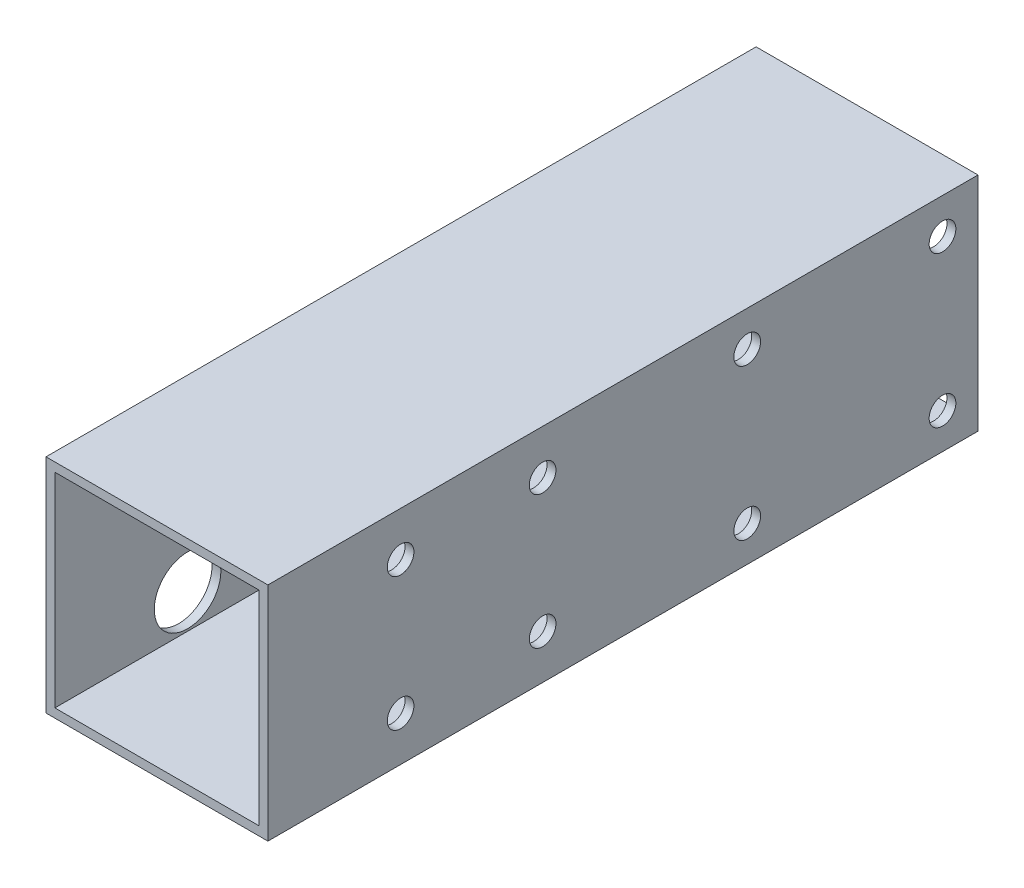
ISO-10303-21;
HEADER;
FILE_DESCRIPTION(('STEP AP214'),'2;1');
FILE_NAME('part.step','',(''),(''),'','','');
FILE_SCHEMA(('AUTOMOTIVE_DESIGN { 1 0 10303 214 1 1 1 1 }'));
ENDSEC;
DATA;
#1=APPLICATION_CONTEXT('core data for automotive mechanical design processes');
#2=APPLICATION_PROTOCOL_DEFINITION('international standard','automotive_design',2000,#1);
#3=PRODUCT_CONTEXT('',#1,'mechanical');
#4=PRODUCT('Part','Part','',(#3));
#5=PRODUCT_RELATED_PRODUCT_CATEGORY('part','',(#4));
#6=PRODUCT_DEFINITION_FORMATION('','',#4);
#7=PRODUCT_DEFINITION_CONTEXT('part definition',#1,'design');
#8=PRODUCT_DEFINITION('design','',#6,#7);
#9=PRODUCT_DEFINITION_SHAPE('','',#8);
#10=(LENGTH_UNIT() NAMED_UNIT(*) SI_UNIT(.MILLI.,.METRE.));
#11=(NAMED_UNIT(*) PLANE_ANGLE_UNIT() SI_UNIT($,.RADIAN.));
#12=(NAMED_UNIT(*) SI_UNIT($,.STERADIAN.) SOLID_ANGLE_UNIT());
#13=UNCERTAINTY_MEASURE_WITH_UNIT(LENGTH_MEASURE(1.E-05),#10,'distance_accuracy_value','');
#14=(GEOMETRIC_REPRESENTATION_CONTEXT(3) GLOBAL_UNCERTAINTY_ASSIGNED_CONTEXT((#13)) GLOBAL_UNIT_ASSIGNED_CONTEXT((#10,
#11,#12)) REPRESENTATION_CONTEXT('',''));
#15=CARTESIAN_POINT('',(0.,0.,0.));
#16=DIRECTION('',(0.,0.,1.));
#17=DIRECTION('',(1.,0.,0.));
#18=AXIS2_PLACEMENT_3D('',#15,#16,#17);
#19=CARTESIAN_POINT('',(0.,0.,40.));
#20=DIRECTION('',(0.,0.,-1.));
#21=DIRECTION('',(-1.,0.,0.));
#22=AXIS2_PLACEMENT_3D('',#19,#20,#21);
#23=PLANE('',#22);
#24=DIRECTION('',(0.,1.,0.));
#25=VECTOR('',#24,1.);
#26=CARTESIAN_POINT('',(12.5,-12.5,40.));
#27=LINE('',#26,#25);
#28=CARTESIAN_POINT('',(12.5,-12.5,40.));
#29=VERTEX_POINT('',#28);
#30=CARTESIAN_POINT('',(12.5,12.5,40.));
#31=VERTEX_POINT('',#30);
#32=EDGE_CURVE('E139',#29,#31,#27,.T.);
#33=ORIENTED_EDGE('',*,*,#32,.T.);
#34=DIRECTION('',(-1.,0.,0.));
#35=VECTOR('',#34,1.);
#36=CARTESIAN_POINT('',(-12.5,12.5,40.));
#37=LINE('',#36,#35);
#38=CARTESIAN_POINT('',(-12.5,12.5,40.));
#39=VERTEX_POINT('',#38);
#40=EDGE_CURVE('E142',#31,#39,#37,.T.);
#41=ORIENTED_EDGE('',*,*,#40,.T.);
#42=DIRECTION('',(0.,-1.,0.));
#43=VECTOR('',#42,1.);
#44=CARTESIAN_POINT('',(-12.5,-12.5,40.));
#45=LINE('',#44,#43);
#46=CARTESIAN_POINT('',(-12.5,-12.5,40.));
#47=VERTEX_POINT('',#46);
#48=EDGE_CURVE('E145',#39,#47,#45,.T.);
#49=ORIENTED_EDGE('',*,*,#48,.T.);
#50=DIRECTION('',(1.,0.,0.));
#51=VECTOR('',#50,1.);
#52=CARTESIAN_POINT('',(-12.5,-12.5,40.));
#53=LINE('',#52,#51);
#54=EDGE_CURVE('E147',#47,#29,#53,.T.);
#55=ORIENTED_EDGE('',*,*,#54,.T.);
#56=EDGE_LOOP('',(#33,#41,#49,#55));
#57=FACE_BOUND('',#56,.T.);
#58=DIRECTION('',(1.,0.,0.));
#59=VECTOR('',#58,1.);
#60=CARTESIAN_POINT('',(-11.5,-11.5,40.));
#61=LINE('',#60,#59);
#62=CARTESIAN_POINT('',(-11.5,-11.5,40.));
#63=VERTEX_POINT('',#62);
#64=CARTESIAN_POINT('',(11.5,-11.5,40.));
#65=VERTEX_POINT('',#64);
#66=EDGE_CURVE('E101',#63,#65,#61,.T.);
#67=ORIENTED_EDGE('',*,*,#66,.F.);
#68=DIRECTION('',(0.,-1.,0.));
#69=VECTOR('',#68,1.);
#70=CARTESIAN_POINT('',(-11.5,-11.5,40.));
#71=LINE('',#70,#69);
#72=CARTESIAN_POINT('',(-11.5,11.5,40.));
#73=VERTEX_POINT('',#72);
#74=EDGE_CURVE('E123',#73,#63,#71,.T.);
#75=ORIENTED_EDGE('',*,*,#74,.F.);
#76=DIRECTION('',(-1.,0.,0.));
#77=VECTOR('',#76,1.);
#78=CARTESIAN_POINT('',(-11.5,11.5,40.));
#79=LINE('',#78,#77);
#80=CARTESIAN_POINT('',(11.5,11.5,40.));
#81=VERTEX_POINT('',#80);
#82=EDGE_CURVE('E121',#81,#73,#79,.T.);
#83=ORIENTED_EDGE('',*,*,#82,.F.);
#84=DIRECTION('',(0.,1.,0.));
#85=VECTOR('',#84,1.);
#86=CARTESIAN_POINT('',(11.5,-11.5,40.));
#87=LINE('',#86,#85);
#88=EDGE_CURVE('E109',#65,#81,#87,.T.);
#89=ORIENTED_EDGE('',*,*,#88,.F.);
#90=EDGE_LOOP('',(#67,#75,#83,#89));
#91=FACE_BOUND('',#90,.T.);
#92=ADVANCED_FACE('F34',(#57,#91),#23,.F.);
#93=CARTESIAN_POINT('',(0.,0.,-40.));
#94=DIRECTION('',(0.,0.,-1.));
#95=DIRECTION('',(-1.,0.,0.));
#96=AXIS2_PLACEMENT_3D('',#93,#94,#95);
#97=PLANE('',#96);
#98=DIRECTION('',(0.,1.,0.));
#99=VECTOR('',#98,1.);
#100=CARTESIAN_POINT('',(12.5,-12.5,-40.));
#101=LINE('',#100,#99);
#102=CARTESIAN_POINT('',(12.5,-12.5,-40.));
#103=VERTEX_POINT('',#102);
#104=CARTESIAN_POINT('',(12.5,12.5,-40.));
#105=VERTEX_POINT('',#104);
#106=EDGE_CURVE('E117',#103,#105,#101,.T.);
#107=ORIENTED_EDGE('',*,*,#106,.F.);
#108=DIRECTION('',(1.,0.,0.));
#109=VECTOR('',#108,1.);
#110=CARTESIAN_POINT('',(-12.5,-12.5,-40.));
#111=LINE('',#110,#109);
#112=CARTESIAN_POINT('',(-12.5,-12.5,-40.));
#113=VERTEX_POINT('',#112);
#114=EDGE_CURVE('E143',#113,#103,#111,.T.);
#115=ORIENTED_EDGE('',*,*,#114,.F.);
#116=DIRECTION('',(0.,-1.,0.));
#117=VECTOR('',#116,1.);
#118=CARTESIAN_POINT('',(-12.5,-12.5,-40.));
#119=LINE('',#118,#117);
#120=CARTESIAN_POINT('',(-12.5,12.5,-40.));
#121=VERTEX_POINT('',#120);
#122=EDGE_CURVE('E154',#121,#113,#119,.T.);
#123=ORIENTED_EDGE('',*,*,#122,.F.);
#124=DIRECTION('',(-1.,0.,0.));
#125=VECTOR('',#124,1.);
#126=CARTESIAN_POINT('',(-12.5,12.5,-40.));
#127=LINE('',#126,#125);
#128=EDGE_CURVE('E152',#105,#121,#127,.T.);
#129=ORIENTED_EDGE('',*,*,#128,.F.);
#130=EDGE_LOOP('',(#107,#115,#123,#129));
#131=FACE_BOUND('',#130,.T.);
#132=DIRECTION('',(0.,-1.,0.));
#133=VECTOR('',#132,1.);
#134=CARTESIAN_POINT('',(-11.5,-11.5,-40.));
#135=LINE('',#134,#133);
#136=CARTESIAN_POINT('',(-11.5,11.5,-40.));
#137=VERTEX_POINT('',#136);
#138=CARTESIAN_POINT('',(-11.5,-11.5,-40.));
#139=VERTEX_POINT('',#138);
#140=EDGE_CURVE('E110',#137,#139,#135,.T.);
#141=ORIENTED_EDGE('',*,*,#140,.T.);
#142=DIRECTION('',(1.,0.,0.));
#143=VECTOR('',#142,1.);
#144=CARTESIAN_POINT('',(-11.5,-11.5,-40.));
#145=LINE('',#144,#143);
#146=CARTESIAN_POINT('',(11.5,-11.5,-40.));
#147=VERTEX_POINT('',#146);
#148=EDGE_CURVE('E59',#139,#147,#145,.T.);
#149=ORIENTED_EDGE('',*,*,#148,.T.);
#150=DIRECTION('',(0.,1.,0.));
#151=VECTOR('',#150,1.);
#152=CARTESIAN_POINT('',(11.5,-11.5,-40.));
#153=LINE('',#152,#151);
#154=CARTESIAN_POINT('',(11.5,11.5,-40.));
#155=VERTEX_POINT('',#154);
#156=EDGE_CURVE('E116',#147,#155,#153,.T.);
#157=ORIENTED_EDGE('',*,*,#156,.T.);
#158=DIRECTION('',(-1.,0.,0.));
#159=VECTOR('',#158,1.);
#160=CARTESIAN_POINT('',(-11.5,11.5,-40.));
#161=LINE('',#160,#159);
#162=EDGE_CURVE('E131',#155,#137,#161,.T.);
#163=ORIENTED_EDGE('',*,*,#162,.T.);
#164=EDGE_LOOP('',(#141,#149,#157,#163));
#165=FACE_BOUND('',#164,.T.);
#166=ADVANCED_FACE('F256',(#131,#165),#97,.T.);
#167=CARTESIAN_POINT('',(12.5,-12.5,40.));
#168=DIRECTION('',(-1.,0.,0.));
#169=DIRECTION('',(0.,-1.,0.));
#170=AXIS2_PLACEMENT_3D('',#167,#168,#169);
#171=PLANE('',#170);
#172=CARTESIAN_POINT('',(12.5,-8.5,-36.));
#173=DIRECTION('',(-1.,0.,0.));
#174=DIRECTION('',(0.,-1.,0.));
#175=AXIS2_PLACEMENT_3D('',#172,#173,#174);
#176=CIRCLE('',#175,1.505);
#177=CARTESIAN_POINT('',(12.5,-10.005,-36.));
#178=VERTEX_POINT('',#177);
#179=EDGE_CURVE('E398',#178,#178,#176,.F.);
#180=ORIENTED_EDGE('',*,*,#179,.F.);
#181=EDGE_LOOP('',(#180));
#182=FACE_BOUND('',#181,.T.);
#183=CARTESIAN_POINT('',(12.5,-8.5,-14.));
#184=DIRECTION('',(-1.,0.,0.));
#185=DIRECTION('',(0.,-1.,0.));
#186=AXIS2_PLACEMENT_3D('',#183,#184,#185);
#187=CIRCLE('',#186,1.505);
#188=CARTESIAN_POINT('',(12.5,-10.005,-14.));
#189=VERTEX_POINT('',#188);
#190=EDGE_CURVE('E392',#189,#189,#187,.F.);
#191=ORIENTED_EDGE('',*,*,#190,.F.);
#192=EDGE_LOOP('',(#191));
#193=FACE_BOUND('',#192,.T.);
#194=CARTESIAN_POINT('',(12.5,8.49999999999999,-14.));
#195=DIRECTION('',(-1.,0.,0.));
#196=DIRECTION('',(0.,-1.,0.));
#197=AXIS2_PLACEMENT_3D('',#194,#195,#196);
#198=CIRCLE('',#197,1.505);
#199=CARTESIAN_POINT('',(12.5,6.99499999999999,-14.));
#200=VERTEX_POINT('',#199);
#201=EDGE_CURVE('E384',#200,#200,#198,.F.);
#202=ORIENTED_EDGE('',*,*,#201,.F.);
#203=EDGE_LOOP('',(#202));
#204=FACE_BOUND('',#203,.T.);
#205=CARTESIAN_POINT('',(12.5,8.5,-36.));
#206=DIRECTION('',(-1.,0.,0.));
#207=DIRECTION('',(0.,-1.,0.));
#208=AXIS2_PLACEMENT_3D('',#205,#206,#207);
#209=CIRCLE('',#208,1.505);
#210=CARTESIAN_POINT('',(12.5,6.995,-36.));
#211=VERTEX_POINT('',#210);
#212=EDGE_CURVE('E168',#211,#211,#209,.F.);
#213=ORIENTED_EDGE('',*,*,#212,.F.);
#214=EDGE_LOOP('',(#213));
#215=FACE_BOUND('',#214,.T.);
#216=CARTESIAN_POINT('',(12.5,-7.50000000000001,9.05000000000001));
#217=DIRECTION('',(-1.,0.,0.));
#218=DIRECTION('',(0.,-1.,0.));
#219=AXIS2_PLACEMENT_3D('',#216,#217,#218);
#220=CIRCLE('',#219,1.5);
#221=CARTESIAN_POINT('',(12.5,-9.00000000000001,9.05000000000001));
#222=VERTEX_POINT('',#221);
#223=EDGE_CURVE('E129',#222,#222,#220,.T.);
#224=ORIENTED_EDGE('',*,*,#223,.T.);
#225=EDGE_LOOP('',(#224));
#226=FACE_BOUND('',#225,.T.);
#227=CARTESIAN_POINT('',(12.5,7.49999999999998,9.05000000000001));
#228=DIRECTION('',(-1.,0.,0.));
#229=DIRECTION('',(0.,-1.,0.));
#230=AXIS2_PLACEMENT_3D('',#227,#228,#229);
#231=CIRCLE('',#230,1.5);
#232=CARTESIAN_POINT('',(12.5,5.99999999999998,9.05000000000001));
#233=VERTEX_POINT('',#232);
#234=EDGE_CURVE('E231',#233,#233,#231,.T.);
#235=ORIENTED_EDGE('',*,*,#234,.T.);
#236=EDGE_LOOP('',(#235));
#237=FACE_BOUND('',#236,.T.);
#238=CARTESIAN_POINT('',(12.5,7.49999999999999,25.05));
#239=DIRECTION('',(-1.,0.,0.));
#240=DIRECTION('',(0.,-1.,0.));
#241=AXIS2_PLACEMENT_3D('',#238,#239,#240);
#242=CIRCLE('',#241,1.5);
#243=CARTESIAN_POINT('',(12.5,5.99999999999999,25.05));
#244=VERTEX_POINT('',#243);
#245=EDGE_CURVE('E228',#244,#244,#242,.T.);
#246=ORIENTED_EDGE('',*,*,#245,.T.);
#247=EDGE_LOOP('',(#246));
#248=FACE_BOUND('',#247,.T.);
#249=CARTESIAN_POINT('',(12.5,-7.50000000000001,25.05));
#250=DIRECTION('',(-1.,0.,0.));
#251=DIRECTION('',(0.,-1.,0.));
#252=AXIS2_PLACEMENT_3D('',#249,#250,#251);
#253=CIRCLE('',#252,1.5);
#254=CARTESIAN_POINT('',(12.5,-9.00000000000001,25.05));
#255=VERTEX_POINT('',#254);
#256=EDGE_CURVE('E225',#255,#255,#253,.T.);
#257=ORIENTED_EDGE('',*,*,#256,.T.);
#258=EDGE_LOOP('',(#257));
#259=FACE_BOUND('',#258,.T.);
#260=ORIENTED_EDGE('',*,*,#106,.T.);
#261=DIRECTION('',(0.,0.,-1.));
#262=VECTOR('',#261,1.);
#263=CARTESIAN_POINT('',(12.5,12.5,40.));
#264=LINE('',#263,#262);
#265=EDGE_CURVE('E11',#31,#105,#264,.T.);
#266=ORIENTED_EDGE('',*,*,#265,.F.);
#267=ORIENTED_EDGE('',*,*,#32,.F.);
#268=DIRECTION('',(0.,0.,-1.));
#269=VECTOR('',#268,1.);
#270=CARTESIAN_POINT('',(12.5,-12.5,40.));
#271=LINE('',#270,#269);
#272=EDGE_CURVE('E149',#29,#103,#271,.T.);
#273=ORIENTED_EDGE('',*,*,#272,.T.);
#274=EDGE_LOOP('',(#260,#266,#267,#273));
#275=FACE_BOUND('',#274,.T.);
#276=ADVANCED_FACE('F36',(#182,#193,#204,#215,#226,#237,#248,#259,#275),#171,.F.);
#277=CARTESIAN_POINT('',(-12.5,12.5,40.));
#278=DIRECTION('',(0.,-1.,0.));
#279=DIRECTION('',(0.,0.,-1.));
#280=AXIS2_PLACEMENT_3D('',#277,#278,#279);
#281=PLANE('',#280);
#282=ORIENTED_EDGE('',*,*,#128,.T.);
#283=DIRECTION('',(0.,0.,-1.));
#284=VECTOR('',#283,1.);
#285=CARTESIAN_POINT('',(-12.5,12.5,40.));
#286=LINE('',#285,#284);
#287=EDGE_CURVE('E43',#39,#121,#286,.T.);
#288=ORIENTED_EDGE('',*,*,#287,.F.);
#289=ORIENTED_EDGE('',*,*,#40,.F.);
#290=ORIENTED_EDGE('',*,*,#265,.T.);
#291=EDGE_LOOP('',(#282,#288,#289,#290));
#292=FACE_BOUND('',#291,.T.);
#293=ADVANCED_FACE('F273',(#292),#281,.F.);
#294=CARTESIAN_POINT('',(-12.5,-12.5,40.));
#295=DIRECTION('',(1.,0.,0.));
#296=DIRECTION('',(0.,1.,0.));
#297=AXIS2_PLACEMENT_3D('',#294,#295,#296);
#298=PLANE('',#297);
#299=CARTESIAN_POINT('',(-12.5,-8.5,-36.));
#300=DIRECTION('',(-1.,0.,0.));
#301=DIRECTION('',(0.,-1.,0.));
#302=AXIS2_PLACEMENT_3D('',#299,#300,#301);
#303=CIRCLE('',#302,1.505);
#304=CARTESIAN_POINT('',(-12.5,-10.005,-36.));
#305=VERTEX_POINT('',#304);
#306=EDGE_CURVE('E401',#305,#305,#303,.T.);
#307=ORIENTED_EDGE('',*,*,#306,.F.);
#308=EDGE_LOOP('',(#307));
#309=FACE_BOUND('',#308,.T.);
#310=CARTESIAN_POINT('',(-12.5,-8.5,-14.));
#311=DIRECTION('',(-1.,0.,0.));
#312=DIRECTION('',(0.,-1.,0.));
#313=AXIS2_PLACEMENT_3D('',#310,#311,#312);
#314=CIRCLE('',#313,1.505);
#315=CARTESIAN_POINT('',(-12.5,-10.005,-14.));
#316=VERTEX_POINT('',#315);
#317=EDGE_CURVE('E395',#316,#316,#314,.T.);
#318=ORIENTED_EDGE('',*,*,#317,.F.);
#319=EDGE_LOOP('',(#318));
#320=FACE_BOUND('',#319,.T.);
#321=CARTESIAN_POINT('',(-12.5,8.49999999999999,-14.));
#322=DIRECTION('',(-1.,0.,0.));
#323=DIRECTION('',(0.,-1.,0.));
#324=AXIS2_PLACEMENT_3D('',#321,#322,#323);
#325=CIRCLE('',#324,1.505);
#326=CARTESIAN_POINT('',(-12.5,6.99499999999999,-14.));
#327=VERTEX_POINT('',#326);
#328=EDGE_CURVE('E387',#327,#327,#325,.T.);
#329=ORIENTED_EDGE('',*,*,#328,.F.);
#330=EDGE_LOOP('',(#329));
#331=FACE_BOUND('',#330,.T.);
#332=CARTESIAN_POINT('',(-12.5,8.5,-36.));
#333=DIRECTION('',(-1.,0.,0.));
#334=DIRECTION('',(0.,-1.,0.));
#335=AXIS2_PLACEMENT_3D('',#332,#333,#334);
#336=CIRCLE('',#335,1.505);
#337=CARTESIAN_POINT('',(-12.5,6.995,-36.));
#338=VERTEX_POINT('',#337);
#339=EDGE_CURVE('E386',#338,#338,#336,.T.);
#340=ORIENTED_EDGE('',*,*,#339,.F.);
#341=EDGE_LOOP('',(#340));
#342=FACE_BOUND('',#341,.T.);
#343=CARTESIAN_POINT('',(-12.5,7.49999999999998,9.05000000000001));
#344=DIRECTION('',(-1.,0.,0.));
#345=DIRECTION('',(0.,-1.,0.));
#346=AXIS2_PLACEMENT_3D('',#343,#344,#345);
#347=CIRCLE('',#346,3.75);
#348=CARTESIAN_POINT('',(-12.5,3.74999999999998,9.05000000000001));
#349=VERTEX_POINT('',#348);
#350=EDGE_CURVE('E196',#349,#349,#347,.T.);
#351=ORIENTED_EDGE('',*,*,#350,.F.);
#352=EDGE_LOOP('',(#351));
#353=FACE_BOUND('',#352,.T.);
#354=CARTESIAN_POINT('',(-12.5,-7.50000000000002,25.05));
#355=DIRECTION('',(-1.,0.,0.));
#356=DIRECTION('',(0.,-1.,0.));
#357=AXIS2_PLACEMENT_3D('',#354,#355,#356);
#358=CIRCLE('',#357,3.75);
#359=CARTESIAN_POINT('',(-12.5,-11.25,25.05));
#360=VERTEX_POINT('',#359);
#361=EDGE_CURVE('E195',#360,#360,#358,.T.);
#362=ORIENTED_EDGE('',*,*,#361,.F.);
#363=EDGE_LOOP('',(#362));
#364=FACE_BOUND('',#363,.T.);
#365=CARTESIAN_POINT('',(-12.5,-7.50000000000002,9.05000000000001));
#366=DIRECTION('',(-1.,0.,0.));
#367=DIRECTION('',(0.,-1.,0.));
#368=AXIS2_PLACEMENT_3D('',#365,#366,#367);
#369=CIRCLE('',#368,3.75);
#370=CARTESIAN_POINT('',(-12.5,-11.25,9.05000000000001));
#371=VERTEX_POINT('',#370);
#372=EDGE_CURVE('E189',#371,#371,#369,.T.);
#373=ORIENTED_EDGE('',*,*,#372,.F.);
#374=EDGE_LOOP('',(#373));
#375=FACE_BOUND('',#374,.T.);
#376=CARTESIAN_POINT('',(-12.5,7.49999999999998,25.05));
#377=DIRECTION('',(-1.,0.,0.));
#378=DIRECTION('',(0.,-1.,0.));
#379=AXIS2_PLACEMENT_3D('',#376,#377,#378);
#380=CIRCLE('',#379,3.75);
#381=CARTESIAN_POINT('',(-12.5,3.74999999999998,25.05));
#382=VERTEX_POINT('',#381);
#383=EDGE_CURVE('E203',#382,#382,#380,.T.);
#384=ORIENTED_EDGE('',*,*,#383,.F.);
#385=EDGE_LOOP('',(#384));
#386=FACE_BOUND('',#385,.T.);
#387=ORIENTED_EDGE('',*,*,#122,.T.);
#388=DIRECTION('',(0.,0.,-1.));
#389=VECTOR('',#388,1.);
#390=CARTESIAN_POINT('',(-12.5,-12.5,40.));
#391=LINE('',#390,#389);
#392=EDGE_CURVE('E159',#47,#113,#391,.T.);
#393=ORIENTED_EDGE('',*,*,#392,.F.);
#394=ORIENTED_EDGE('',*,*,#48,.F.);
#395=ORIENTED_EDGE('',*,*,#287,.T.);
#396=EDGE_LOOP('',(#387,#393,#394,#395));
#397=FACE_BOUND('',#396,.T.);
#398=ADVANCED_FACE('F270',(#309,#320,#331,#342,#353,#364,#375,#386,#397),#298,.F.);
#399=CARTESIAN_POINT('',(-12.5,-12.5,40.));
#400=DIRECTION('',(0.,1.,0.));
#401=DIRECTION('',(-1.,0.,0.));
#402=AXIS2_PLACEMENT_3D('',#399,#400,#401);
#403=PLANE('',#402);
#404=ORIENTED_EDGE('',*,*,#114,.T.);
#405=ORIENTED_EDGE('',*,*,#272,.F.);
#406=ORIENTED_EDGE('',*,*,#54,.F.);
#407=ORIENTED_EDGE('',*,*,#392,.T.);
#408=EDGE_LOOP('',(#404,#405,#406,#407));
#409=FACE_BOUND('',#408,.T.);
#410=ADVANCED_FACE('F267',(#409),#403,.F.);
#411=CARTESIAN_POINT('',(-11.5,-11.5,40.));
#412=DIRECTION('',(0.,1.,0.));
#413=DIRECTION('',(0.,0.,1.));
#414=AXIS2_PLACEMENT_3D('',#411,#412,#413);
#415=PLANE('',#414);
#416=ORIENTED_EDGE('',*,*,#148,.F.);
#417=DIRECTION('',(0.,0.,-1.));
#418=VECTOR('',#417,1.);
#419=CARTESIAN_POINT('',(-11.5,-11.5,40.));
#420=LINE('',#419,#418);
#421=EDGE_CURVE('E105',#63,#139,#420,.T.);
#422=ORIENTED_EDGE('',*,*,#421,.F.);
#423=ORIENTED_EDGE('',*,*,#66,.T.);
#424=DIRECTION('',(0.,0.,-1.));
#425=VECTOR('',#424,1.);
#426=CARTESIAN_POINT('',(11.5,-11.5,40.));
#427=LINE('',#426,#425);
#428=EDGE_CURVE('E104',#65,#147,#427,.T.);
#429=ORIENTED_EDGE('',*,*,#428,.T.);
#430=EDGE_LOOP('',(#416,#422,#423,#429));
#431=FACE_BOUND('',#430,.T.);
#432=ADVANCED_FACE('F103',(#431),#415,.T.);
#433=CARTESIAN_POINT('',(11.5,-11.5,40.));
#434=DIRECTION('',(-1.,0.,0.));
#435=DIRECTION('',(0.,-1.,0.));
#436=AXIS2_PLACEMENT_3D('',#433,#434,#435);
#437=PLANE('',#436);
#438=CARTESIAN_POINT('',(11.5,-8.5,-36.));
#439=DIRECTION('',(-1.,0.,0.));
#440=DIRECTION('',(0.,-1.,0.));
#441=AXIS2_PLACEMENT_3D('',#438,#439,#440);
#442=CIRCLE('',#441,1.505);
#443=CARTESIAN_POINT('',(11.5,-10.005,-36.));
#444=VERTEX_POINT('',#443);
#445=EDGE_CURVE('E186',#444,#444,#442,.T.);
#446=ORIENTED_EDGE('',*,*,#445,.F.);
#447=EDGE_LOOP('',(#446));
#448=FACE_BOUND('',#447,.T.);
#449=CARTESIAN_POINT('',(11.5,-8.5,-14.));
#450=DIRECTION('',(-1.,0.,0.));
#451=DIRECTION('',(0.,-1.,0.));
#452=AXIS2_PLACEMENT_3D('',#449,#450,#451);
#453=CIRCLE('',#452,1.505);
#454=CARTESIAN_POINT('',(11.5,-10.005,-14.));
#455=VERTEX_POINT('',#454);
#456=EDGE_CURVE('E174',#455,#455,#453,.T.);
#457=ORIENTED_EDGE('',*,*,#456,.F.);
#458=EDGE_LOOP('',(#457));
#459=FACE_BOUND('',#458,.T.);
#460=CARTESIAN_POINT('',(11.5,8.49999999999999,-14.));
#461=DIRECTION('',(-1.,0.,0.));
#462=DIRECTION('',(0.,-1.,0.));
#463=AXIS2_PLACEMENT_3D('',#460,#461,#462);
#464=CIRCLE('',#463,1.505);
#465=CARTESIAN_POINT('',(11.5,6.99499999999999,-14.));
#466=VERTEX_POINT('',#465);
#467=EDGE_CURVE('E171',#466,#466,#464,.T.);
#468=ORIENTED_EDGE('',*,*,#467,.F.);
#469=EDGE_LOOP('',(#468));
#470=FACE_BOUND('',#469,.T.);
#471=CARTESIAN_POINT('',(11.5,8.5,-36.));
#472=DIRECTION('',(-1.,0.,0.));
#473=DIRECTION('',(0.,-1.,0.));
#474=AXIS2_PLACEMENT_3D('',#471,#472,#473);
#475=CIRCLE('',#474,1.505);
#476=CARTESIAN_POINT('',(11.5,6.995,-36.));
#477=VERTEX_POINT('',#476);
#478=EDGE_CURVE('E167',#477,#477,#475,.T.);
#479=ORIENTED_EDGE('',*,*,#478,.F.);
#480=EDGE_LOOP('',(#479));
#481=FACE_BOUND('',#480,.T.);
#482=CARTESIAN_POINT('',(11.5,-7.50000000000001,9.05000000000001));
#483=DIRECTION('',(-1.,0.,0.));
#484=DIRECTION('',(0.,-1.,0.));
#485=AXIS2_PLACEMENT_3D('',#482,#483,#484);
#486=CIRCLE('',#485,1.5);
#487=CARTESIAN_POINT('',(11.5,-9.00000000000001,9.05000000000001));
#488=VERTEX_POINT('',#487);
#489=EDGE_CURVE('E213',#488,#488,#486,.T.);
#490=ORIENTED_EDGE('',*,*,#489,.F.);
#491=EDGE_LOOP('',(#490));
#492=FACE_BOUND('',#491,.T.);
#493=CARTESIAN_POINT('',(11.5,7.49999999999998,9.05000000000001));
#494=DIRECTION('',(-1.,0.,0.));
#495=DIRECTION('',(0.,-1.,0.));
#496=AXIS2_PLACEMENT_3D('',#493,#494,#495);
#497=CIRCLE('',#496,1.5);
#498=CARTESIAN_POINT('',(11.5,5.99999999999998,9.05000000000001));
#499=VERTEX_POINT('',#498);
#500=EDGE_CURVE('E218',#499,#499,#497,.T.);
#501=ORIENTED_EDGE('',*,*,#500,.F.);
#502=EDGE_LOOP('',(#501));
#503=FACE_BOUND('',#502,.T.);
#504=CARTESIAN_POINT('',(11.5,7.49999999999999,25.05));
#505=DIRECTION('',(-1.,0.,0.));
#506=DIRECTION('',(0.,-1.,0.));
#507=AXIS2_PLACEMENT_3D('',#504,#505,#506);
#508=CIRCLE('',#507,1.5);
#509=CARTESIAN_POINT('',(11.5,5.99999999999999,25.05));
#510=VERTEX_POINT('',#509);
#511=EDGE_CURVE('E214',#510,#510,#508,.T.);
#512=ORIENTED_EDGE('',*,*,#511,.F.);
#513=EDGE_LOOP('',(#512));
#514=FACE_BOUND('',#513,.T.);
#515=CARTESIAN_POINT('',(11.5,-7.50000000000001,25.05));
#516=DIRECTION('',(-1.,0.,0.));
#517=DIRECTION('',(0.,-1.,0.));
#518=AXIS2_PLACEMENT_3D('',#515,#516,#517);
#519=CIRCLE('',#518,1.5);
#520=CARTESIAN_POINT('',(11.5,-9.00000000000001,25.05));
#521=VERTEX_POINT('',#520);
#522=EDGE_CURVE('E217',#521,#521,#519,.T.);
#523=ORIENTED_EDGE('',*,*,#522,.F.);
#524=EDGE_LOOP('',(#523));
#525=FACE_BOUND('',#524,.T.);
#526=ORIENTED_EDGE('',*,*,#156,.F.);
#527=ORIENTED_EDGE('',*,*,#428,.F.);
#528=ORIENTED_EDGE('',*,*,#88,.T.);
#529=DIRECTION('',(0.,0.,-1.));
#530=VECTOR('',#529,1.);
#531=CARTESIAN_POINT('',(11.5,11.5,40.));
#532=LINE('',#531,#530);
#533=EDGE_CURVE('E118',#81,#155,#532,.T.);
#534=ORIENTED_EDGE('',*,*,#533,.T.);
#535=EDGE_LOOP('',(#526,#527,#528,#534));
#536=FACE_BOUND('',#535,.T.);
#537=ADVANCED_FACE('F113',(#448,#459,#470,#481,#492,#503,#514,#525,#536),#437,.T.);
#538=CARTESIAN_POINT('',(-11.5,11.5,40.));
#539=DIRECTION('',(0.,-1.,0.));
#540=DIRECTION('',(0.,0.,-1.));
#541=AXIS2_PLACEMENT_3D('',#538,#539,#540);
#542=PLANE('',#541);
#543=ORIENTED_EDGE('',*,*,#162,.F.);
#544=ORIENTED_EDGE('',*,*,#533,.F.);
#545=ORIENTED_EDGE('',*,*,#82,.T.);
#546=DIRECTION('',(0.,0.,-1.));
#547=VECTOR('',#546,1.);
#548=CARTESIAN_POINT('',(-11.5,11.5,40.));
#549=LINE('',#548,#547);
#550=EDGE_CURVE('E51',#73,#137,#549,.T.);
#551=ORIENTED_EDGE('',*,*,#550,.T.);
#552=EDGE_LOOP('',(#543,#544,#545,#551));
#553=FACE_BOUND('',#552,.T.);
#554=ADVANCED_FACE('F298',(#553),#542,.T.);
#555=CARTESIAN_POINT('',(-11.5,-11.5,40.));
#556=DIRECTION('',(1.,0.,0.));
#557=DIRECTION('',(0.,0.,-1.));
#558=AXIS2_PLACEMENT_3D('',#555,#556,#557);
#559=PLANE('',#558);
#560=CARTESIAN_POINT('',(-11.5,-8.5,-36.));
#561=DIRECTION('',(1.,0.,0.));
#562=DIRECTION('',(0.,0.,-1.));
#563=AXIS2_PLACEMENT_3D('',#560,#561,#562);
#564=CIRCLE('',#563,1.505);
#565=CARTESIAN_POINT('',(-11.5,-8.5,-37.505));
#566=VERTEX_POINT('',#565);
#567=EDGE_CURVE('E38',#566,#566,#564,.T.);
#568=ORIENTED_EDGE('',*,*,#567,.F.);
#569=EDGE_LOOP('',(#568));
#570=FACE_BOUND('',#569,.T.);
#571=CARTESIAN_POINT('',(-11.5,-8.5,-14.));
#572=DIRECTION('',(1.,0.,0.));
#573=DIRECTION('',(0.,0.,-1.));
#574=AXIS2_PLACEMENT_3D('',#571,#572,#573);
#575=CIRCLE('',#574,1.505);
#576=CARTESIAN_POINT('',(-11.5,-8.5,-15.505));
#577=VERTEX_POINT('',#576);
#578=EDGE_CURVE('E172',#577,#577,#575,.T.);
#579=ORIENTED_EDGE('',*,*,#578,.F.);
#580=EDGE_LOOP('',(#579));
#581=FACE_BOUND('',#580,.T.);
#582=CARTESIAN_POINT('',(-11.5,8.49999999999999,-14.));
#583=DIRECTION('',(1.,0.,0.));
#584=DIRECTION('',(0.,0.,-1.));
#585=AXIS2_PLACEMENT_3D('',#582,#583,#584);
#586=CIRCLE('',#585,1.505);
#587=CARTESIAN_POINT('',(-11.5,8.49999999999999,-15.505));
#588=VERTEX_POINT('',#587);
#589=EDGE_CURVE('E169',#588,#588,#586,.T.);
#590=ORIENTED_EDGE('',*,*,#589,.F.);
#591=EDGE_LOOP('',(#590));
#592=FACE_BOUND('',#591,.T.);
#593=CARTESIAN_POINT('',(-11.5,8.5,-36.));
#594=DIRECTION('',(1.,0.,0.));
#595=DIRECTION('',(0.,0.,-1.));
#596=AXIS2_PLACEMENT_3D('',#593,#594,#595);
#597=CIRCLE('',#596,1.505);
#598=CARTESIAN_POINT('',(-11.5,8.5,-37.505));
#599=VERTEX_POINT('',#598);
#600=EDGE_CURVE('E164',#599,#599,#597,.T.);
#601=ORIENTED_EDGE('',*,*,#600,.F.);
#602=EDGE_LOOP('',(#601));
#603=FACE_BOUND('',#602,.T.);
#604=CARTESIAN_POINT('',(-11.5,7.49999999999998,9.05000000000001));
#605=DIRECTION('',(1.,0.,0.));
#606=DIRECTION('',(0.,0.,-1.));
#607=AXIS2_PLACEMENT_3D('',#604,#605,#606);
#608=CIRCLE('',#607,3.75);
#609=CARTESIAN_POINT('',(-11.5,7.49999999999998,5.30000000000001));
#610=VERTEX_POINT('',#609);
#611=EDGE_CURVE('E199',#610,#610,#608,.F.);
#612=ORIENTED_EDGE('',*,*,#611,.T.);
#613=EDGE_LOOP('',(#612));
#614=FACE_BOUND('',#613,.T.);
#615=CARTESIAN_POINT('',(-11.5,-7.50000000000002,25.05));
#616=DIRECTION('',(1.,0.,0.));
#617=DIRECTION('',(0.,0.,-1.));
#618=AXIS2_PLACEMENT_3D('',#615,#616,#617);
#619=CIRCLE('',#618,3.75);
#620=CARTESIAN_POINT('',(-11.5,-7.50000000000002,21.3));
#621=VERTEX_POINT('',#620);
#622=EDGE_CURVE('E200',#621,#621,#619,.F.);
#623=ORIENTED_EDGE('',*,*,#622,.T.);
#624=EDGE_LOOP('',(#623));
#625=FACE_BOUND('',#624,.T.);
#626=CARTESIAN_POINT('',(-11.5,-7.50000000000002,9.05000000000001));
#627=DIRECTION('',(1.,0.,0.));
#628=DIRECTION('',(0.,0.,-1.));
#629=AXIS2_PLACEMENT_3D('',#626,#627,#628);
#630=CIRCLE('',#629,3.75);
#631=CARTESIAN_POINT('',(-11.5,-7.50000000000002,5.30000000000001));
#632=VERTEX_POINT('',#631);
#633=EDGE_CURVE('E192',#632,#632,#630,.F.);
#634=ORIENTED_EDGE('',*,*,#633,.T.);
#635=EDGE_LOOP('',(#634));
#636=FACE_BOUND('',#635,.T.);
#637=CARTESIAN_POINT('',(-11.5,7.49999999999998,25.05));
#638=DIRECTION('',(1.,0.,0.));
#639=DIRECTION('',(0.,0.,-1.));
#640=AXIS2_PLACEMENT_3D('',#637,#638,#639);
#641=CIRCLE('',#640,3.75);
#642=CARTESIAN_POINT('',(-11.5,7.49999999999998,21.3));
#643=VERTEX_POINT('',#642);
#644=EDGE_CURVE('E210',#643,#643,#641,.F.);
#645=ORIENTED_EDGE('',*,*,#644,.T.);
#646=EDGE_LOOP('',(#645));
#647=FACE_BOUND('',#646,.T.);
#648=ORIENTED_EDGE('',*,*,#140,.F.);
#649=ORIENTED_EDGE('',*,*,#550,.F.);
#650=ORIENTED_EDGE('',*,*,#74,.T.);
#651=ORIENTED_EDGE('',*,*,#421,.T.);
#652=EDGE_LOOP('',(#648,#649,#650,#651));
#653=FACE_BOUND('',#652,.T.);
#654=ADVANCED_FACE('F295',(#570,#581,#592,#603,#614,#625,#636,#647,#653),#559,.T.);
#655=CARTESIAN_POINT('',(21.5,-7.50000000000001,25.05));
#656=DIRECTION('',(-1.,0.,0.));
#657=DIRECTION('',(0.,-1.,0.));
#658=AXIS2_PLACEMENT_3D('',#655,#656,#657);
#659=CYLINDRICAL_SURFACE('',#658,1.5);
#660=ORIENTED_EDGE('',*,*,#522,.T.);
#661=EDGE_LOOP('',(#660));
#662=FACE_BOUND('',#661,.T.);
#663=ORIENTED_EDGE('',*,*,#256,.F.);
#664=EDGE_LOOP('',(#663));
#665=FACE_BOUND('',#664,.T.);
#666=ADVANCED_FACE('F297',(#662,#665),#659,.F.);
#667=CARTESIAN_POINT('',(21.5,7.49999999999998,25.05));
#668=DIRECTION('',(-1.,0.,0.));
#669=DIRECTION('',(0.,-1.,0.));
#670=AXIS2_PLACEMENT_3D('',#667,#668,#669);
#671=CYLINDRICAL_SURFACE('',#670,1.5);
#672=ORIENTED_EDGE('',*,*,#511,.T.);
#673=EDGE_LOOP('',(#672));
#674=FACE_BOUND('',#673,.T.);
#675=ORIENTED_EDGE('',*,*,#245,.F.);
#676=EDGE_LOOP('',(#675));
#677=FACE_BOUND('',#676,.T.);
#678=ADVANCED_FACE('F251',(#674,#677),#671,.F.);
#679=CARTESIAN_POINT('',(21.5,7.49999999999998,9.05000000000001));
#680=DIRECTION('',(-1.,0.,0.));
#681=DIRECTION('',(0.,-1.,0.));
#682=AXIS2_PLACEMENT_3D('',#679,#680,#681);
#683=CYLINDRICAL_SURFACE('',#682,1.5);
#684=ORIENTED_EDGE('',*,*,#500,.T.);
#685=EDGE_LOOP('',(#684));
#686=FACE_BOUND('',#685,.T.);
#687=ORIENTED_EDGE('',*,*,#234,.F.);
#688=EDGE_LOOP('',(#687));
#689=FACE_BOUND('',#688,.T.);
#690=ADVANCED_FACE('F241',(#686,#689),#683,.F.);
#691=CARTESIAN_POINT('',(21.5,-7.50000000000001,9.05000000000001));
#692=DIRECTION('',(-1.,0.,0.));
#693=DIRECTION('',(0.,-1.,0.));
#694=AXIS2_PLACEMENT_3D('',#691,#692,#693);
#695=CYLINDRICAL_SURFACE('',#694,1.5);
#696=ORIENTED_EDGE('',*,*,#489,.T.);
#697=EDGE_LOOP('',(#696));
#698=FACE_BOUND('',#697,.T.);
#699=ORIENTED_EDGE('',*,*,#223,.F.);
#700=EDGE_LOOP('',(#699));
#701=FACE_BOUND('',#700,.T.);
#702=ADVANCED_FACE('F238',(#698,#701),#695,.F.);
#703=CARTESIAN_POINT('',(-0.89339828220179,7.49999999999998,25.05));
#704=DIRECTION('',(-1.,0.,0.));
#705=DIRECTION('',(0.,-1.,0.));
#706=AXIS2_PLACEMENT_3D('',#703,#704,#705);
#707=CYLINDRICAL_SURFACE('',#706,3.75);
#708=ORIENTED_EDGE('',*,*,#383,.T.);
#709=EDGE_LOOP('',(#708));
#710=FACE_BOUND('',#709,.T.);
#711=ORIENTED_EDGE('',*,*,#644,.F.);
#712=EDGE_LOOP('',(#711));
#713=FACE_BOUND('',#712,.T.);
#714=ADVANCED_FACE('F240',(#710,#713),#707,.F.);
#715=CARTESIAN_POINT('',(-0.89339828220179,-7.50000000000001,9.05000000000001));
#716=DIRECTION('',(-1.,0.,0.));
#717=DIRECTION('',(0.,-1.,0.));
#718=AXIS2_PLACEMENT_3D('',#715,#716,#717);
#719=CYLINDRICAL_SURFACE('',#718,3.75);
#720=ORIENTED_EDGE('',*,*,#372,.T.);
#721=EDGE_LOOP('',(#720));
#722=FACE_BOUND('',#721,.T.);
#723=ORIENTED_EDGE('',*,*,#633,.F.);
#724=EDGE_LOOP('',(#723));
#725=FACE_BOUND('',#724,.T.);
#726=ADVANCED_FACE('F248',(#722,#725),#719,.F.);
#727=CARTESIAN_POINT('',(-0.89339828220179,-7.50000000000001,25.05));
#728=DIRECTION('',(-1.,0.,0.));
#729=DIRECTION('',(0.,-1.,0.));
#730=AXIS2_PLACEMENT_3D('',#727,#728,#729);
#731=CYLINDRICAL_SURFACE('',#730,3.75);
#732=ORIENTED_EDGE('',*,*,#361,.T.);
#733=EDGE_LOOP('',(#732));
#734=FACE_BOUND('',#733,.T.);
#735=ORIENTED_EDGE('',*,*,#622,.F.);
#736=EDGE_LOOP('',(#735));
#737=FACE_BOUND('',#736,.T.);
#738=ADVANCED_FACE('F342',(#734,#737),#731,.F.);
#739=CARTESIAN_POINT('',(-0.89339828220179,7.49999999999998,9.05000000000001));
#740=DIRECTION('',(-1.,0.,0.));
#741=DIRECTION('',(0.,-1.,0.));
#742=AXIS2_PLACEMENT_3D('',#739,#740,#741);
#743=CYLINDRICAL_SURFACE('',#742,3.75);
#744=ORIENTED_EDGE('',*,*,#350,.T.);
#745=EDGE_LOOP('',(#744));
#746=FACE_BOUND('',#745,.T.);
#747=ORIENTED_EDGE('',*,*,#611,.F.);
#748=EDGE_LOOP('',(#747));
#749=FACE_BOUND('',#748,.T.);
#750=ADVANCED_FACE('F345',(#746,#749),#743,.F.);
#751=CARTESIAN_POINT('',(16.756782822743,8.5,-36.));
#752=DIRECTION('',(-1.,0.,0.));
#753=DIRECTION('',(0.,-1.,0.));
#754=AXIS2_PLACEMENT_3D('',#751,#752,#753);
#755=CYLINDRICAL_SURFACE('',#754,1.505);
#756=ORIENTED_EDGE('',*,*,#600,.T.);
#757=EDGE_LOOP('',(#756));
#758=FACE_BOUND('',#757,.T.);
#759=ORIENTED_EDGE('',*,*,#339,.T.);
#760=EDGE_LOOP('',(#759));
#761=FACE_BOUND('',#760,.T.);
#762=ADVANCED_FACE('F349',(#758,#761),#755,.F.);
#763=CARTESIAN_POINT('',(16.756782822743,8.49999999999999,-14.));
#764=DIRECTION('',(-1.,0.,0.));
#765=DIRECTION('',(0.,-1.,0.));
#766=AXIS2_PLACEMENT_3D('',#763,#764,#765);
#767=CYLINDRICAL_SURFACE('',#766,1.505);
#768=ORIENTED_EDGE('',*,*,#589,.T.);
#769=EDGE_LOOP('',(#768));
#770=FACE_BOUND('',#769,.T.);
#771=ORIENTED_EDGE('',*,*,#328,.T.);
#772=EDGE_LOOP('',(#771));
#773=FACE_BOUND('',#772,.T.);
#774=ADVANCED_FACE('F356',(#770,#773),#767,.F.);
#775=CARTESIAN_POINT('',(16.756782822743,-8.5,-14.));
#776=DIRECTION('',(-1.,0.,0.));
#777=DIRECTION('',(0.,-1.,0.));
#778=AXIS2_PLACEMENT_3D('',#775,#776,#777);
#779=CYLINDRICAL_SURFACE('',#778,1.505);
#780=ORIENTED_EDGE('',*,*,#578,.T.);
#781=EDGE_LOOP('',(#780));
#782=FACE_BOUND('',#781,.T.);
#783=ORIENTED_EDGE('',*,*,#317,.T.);
#784=EDGE_LOOP('',(#783));
#785=FACE_BOUND('',#784,.T.);
#786=ADVANCED_FACE('F362',(#782,#785),#779,.F.);
#787=CARTESIAN_POINT('',(16.756782822743,-8.5,-36.));
#788=DIRECTION('',(-1.,0.,0.));
#789=DIRECTION('',(0.,-1.,0.));
#790=AXIS2_PLACEMENT_3D('',#787,#788,#789);
#791=CYLINDRICAL_SURFACE('',#790,1.505);
#792=ORIENTED_EDGE('',*,*,#567,.T.);
#793=EDGE_LOOP('',(#792));
#794=FACE_BOUND('',#793,.T.);
#795=ORIENTED_EDGE('',*,*,#306,.T.);
#796=EDGE_LOOP('',(#795));
#797=FACE_BOUND('',#796,.T.);
#798=ADVANCED_FACE('F359',(#794,#797),#791,.F.);
#799=ORIENTED_EDGE('',*,*,#478,.T.);
#800=EDGE_LOOP('',(#799));
#801=FACE_BOUND('',#800,.T.);
#802=ORIENTED_EDGE('',*,*,#212,.T.);
#803=EDGE_LOOP('',(#802));
#804=FACE_BOUND('',#803,.T.);
#805=ADVANCED_FACE('F358',(#801,#804),#755,.F.);
#806=ORIENTED_EDGE('',*,*,#467,.T.);
#807=EDGE_LOOP('',(#806));
#808=FACE_BOUND('',#807,.T.);
#809=ORIENTED_EDGE('',*,*,#201,.T.);
#810=EDGE_LOOP('',(#809));
#811=FACE_BOUND('',#810,.T.);
#812=ADVANCED_FACE('F370',(#808,#811),#767,.F.);
#813=ORIENTED_EDGE('',*,*,#456,.T.);
#814=EDGE_LOOP('',(#813));
#815=FACE_BOUND('',#814,.T.);
#816=ORIENTED_EDGE('',*,*,#190,.T.);
#817=EDGE_LOOP('',(#816));
#818=FACE_BOUND('',#817,.T.);
#819=ADVANCED_FACE('F367',(#815,#818),#779,.F.);
#820=ORIENTED_EDGE('',*,*,#445,.T.);
#821=EDGE_LOOP('',(#820));
#822=FACE_BOUND('',#821,.T.);
#823=ORIENTED_EDGE('',*,*,#179,.T.);
#824=EDGE_LOOP('',(#823));
#825=FACE_BOUND('',#824,.T.);
#826=ADVANCED_FACE('F364',(#822,#825),#791,.F.);
#827=CLOSED_SHELL('',(#92,#166,#276,#293,#398,#410,#432,#537,#554,#654,#666,#678,#690,#702,#714,
#726,#738,#750,#762,#774,#786,#798,#805,#812,#819,#826));
#828=MANIFOLD_SOLID_BREP('B2',#827);
#829=ADVANCED_BREP_SHAPE_REPRESENTATION('',(#18,#828),#14);
#830=SHAPE_DEFINITION_REPRESENTATION(#9,#829);
ENDSEC;
END-ISO-10303-21;
